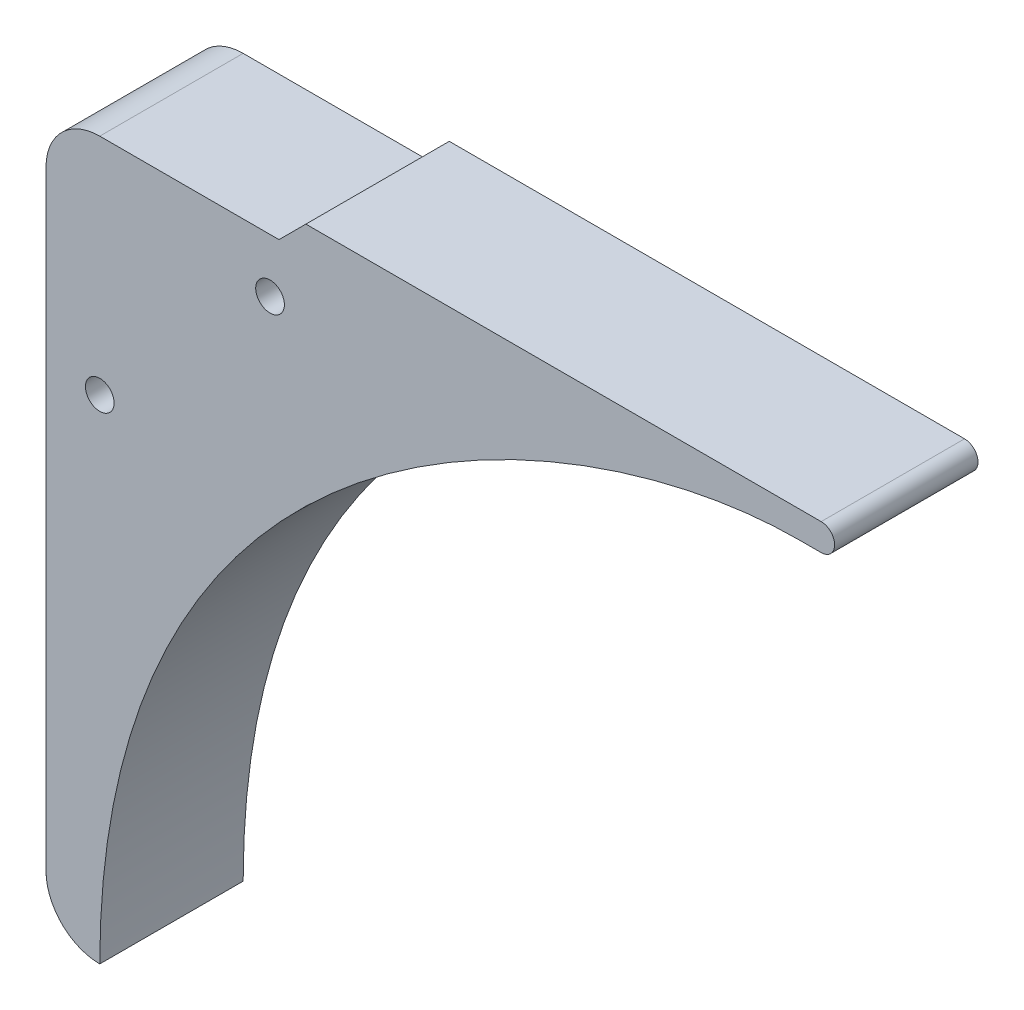
ISO-10303-21;
HEADER;
FILE_DESCRIPTION(('STEP AP214'),'2;1');
FILE_NAME('part.step','',(''),(''),'','','');
FILE_SCHEMA(('AUTOMOTIVE_DESIGN { 1 0 10303 214 1 1 1 1 }'));
ENDSEC;
DATA;
#1=APPLICATION_CONTEXT('core data for automotive mechanical design processes');
#2=APPLICATION_PROTOCOL_DEFINITION('international standard','automotive_design',2000,#1);
#3=PRODUCT_CONTEXT('',#1,'mechanical');
#4=PRODUCT('Part','Part','',(#3));
#5=PRODUCT_RELATED_PRODUCT_CATEGORY('part','',(#4));
#6=PRODUCT_DEFINITION_FORMATION('','',#4);
#7=PRODUCT_DEFINITION_CONTEXT('part definition',#1,'design');
#8=PRODUCT_DEFINITION('design','',#6,#7);
#9=PRODUCT_DEFINITION_SHAPE('','',#8);
#10=(LENGTH_UNIT() NAMED_UNIT(*) SI_UNIT(.MILLI.,.METRE.));
#11=(NAMED_UNIT(*) PLANE_ANGLE_UNIT() SI_UNIT($,.RADIAN.));
#12=(NAMED_UNIT(*) SI_UNIT($,.STERADIAN.) SOLID_ANGLE_UNIT());
#13=UNCERTAINTY_MEASURE_WITH_UNIT(LENGTH_MEASURE(1.E-05),#10,'distance_accuracy_value','');
#14=(GEOMETRIC_REPRESENTATION_CONTEXT(3) GLOBAL_UNCERTAINTY_ASSIGNED_CONTEXT((#13)) GLOBAL_UNIT_ASSIGNED_CONTEXT((#10,
#11,#12)) REPRESENTATION_CONTEXT('',''));
#15=CARTESIAN_POINT('',(0.,0.,0.));
#16=DIRECTION('',(0.,0.,1.));
#17=DIRECTION('',(1.,0.,0.));
#18=AXIS2_PLACEMENT_3D('',#15,#16,#17);
#19=CARTESIAN_POINT('',(43.25,0.75,0.));
#20=DIRECTION('',(0.,0.,1.));
#21=DIRECTION('',(1.,0.,0.));
#22=AXIS2_PLACEMENT_3D('',#19,#20,#21);
#23=CYLINDRICAL_SURFACE('',#22,0.75);
#24=DIRECTION('',(0.,0.,1.));
#25=VECTOR('',#24,1.);
#26=CARTESIAN_POINT('',(43.25,1.5,-8.));
#27=LINE('',#26,#25);
#28=CARTESIAN_POINT('',(43.25,1.5,0.));
#29=VERTEX_POINT('',#28);
#30=CARTESIAN_POINT('',(43.25,1.5,-8.));
#31=VERTEX_POINT('',#30);
#32=EDGE_CURVE('E123',#29,#31,#27,.F.);
#33=ORIENTED_EDGE('',*,*,#32,.F.);
#34=CARTESIAN_POINT('',(43.25,0.75,0.));
#35=DIRECTION('',(0.,0.,1.));
#36=DIRECTION('',(1.,0.,0.));
#37=AXIS2_PLACEMENT_3D('',#34,#35,#36);
#38=CIRCLE('',#37,0.75);
#39=CARTESIAN_POINT('',(43.25,0.,0.));
#40=VERTEX_POINT('',#39);
#41=EDGE_CURVE('E198',#40,#29,#38,.T.);
#42=ORIENTED_EDGE('',*,*,#41,.F.);
#43=DIRECTION('',(0.,0.,1.));
#44=VECTOR('',#43,1.);
#45=CARTESIAN_POINT('',(43.25,0.,-8.));
#46=LINE('',#45,#44);
#47=CARTESIAN_POINT('',(43.25,0.,-8.));
#48=VERTEX_POINT('',#47);
#49=EDGE_CURVE('E202',#48,#40,#46,.T.);
#50=ORIENTED_EDGE('',*,*,#49,.F.);
#51=CARTESIAN_POINT('',(43.25,0.75,-8.));
#52=DIRECTION('',(0.,0.,1.));
#53=DIRECTION('',(1.,0.,0.));
#54=AXIS2_PLACEMENT_3D('',#51,#52,#53);
#55=CIRCLE('',#54,0.75);
#56=EDGE_CURVE('E200',#31,#48,#55,.F.);
#57=ORIENTED_EDGE('',*,*,#56,.F.);
#58=EDGE_LOOP('',(#33,#42,#50,#57));
#59=FACE_BOUND('',#58,.T.);
#60=ADVANCED_FACE('F43',(#59),#23,.T.);
#61=CARTESIAN_POINT('',(44.,0.,-8.));
#62=DIRECTION('',(0.,-1.,0.));
#63=DIRECTION('',(1.,0.,0.));
#64=AXIS2_PLACEMENT_3D('',#61,#62,#63);
#65=PLANE('',#64);
#66=DIRECTION('',(1.,0.,0.));
#67=VECTOR('',#66,1.);
#68=CARTESIAN_POINT('',(44.,0.,-8.));
#69=LINE('',#68,#67);
#70=CARTESIAN_POINT('',(42.,0.,-8.));
#71=VERTEX_POINT('',#70);
#72=EDGE_CURVE('E127',#71,#48,#69,.T.);
#73=ORIENTED_EDGE('',*,*,#72,.T.);
#74=ORIENTED_EDGE('',*,*,#49,.T.);
#75=DIRECTION('',(1.,0.,0.));
#76=VECTOR('',#75,1.);
#77=CARTESIAN_POINT('',(44.,0.,0.));
#78=LINE('',#77,#76);
#79=CARTESIAN_POINT('',(42.,0.,0.));
#80=VERTEX_POINT('',#79);
#81=EDGE_CURVE('E157',#80,#40,#78,.T.);
#82=ORIENTED_EDGE('',*,*,#81,.F.);
#83=DIRECTION('',(0.,0.,1.));
#84=VECTOR('',#83,1.);
#85=CARTESIAN_POINT('',(42.,0.,-8.));
#86=LINE('',#85,#84);
#87=EDGE_CURVE('E228',#71,#80,#86,.T.);
#88=ORIENTED_EDGE('',*,*,#87,.F.);
#89=EDGE_LOOP('',(#73,#74,#82,#88));
#90=FACE_BOUND('',#89,.T.);
#91=ADVANCED_FACE('F168',(#90),#65,.T.);
#92=CARTESIAN_POINT('',(3.,-40.,-8.));
#93=CARTESIAN_POINT('',(2.9999999999999,-11.6867049788812,-8.));
#94=CARTESIAN_POINT('',(28.9884787016492,0.,-8.));
#95=CARTESIAN_POINT('',(42.,0.,-8.));
#96=B_SPLINE_CURVE_WITH_KNOTS('',3,(#92,#93,#94,#95),.UNSPECIFIED.,.F.,.F.,(4,4),(0.,
0.938491694388878),.UNSPECIFIED.);
#97=DIRECTION('',(0.,0.,1.));
#98=VECTOR('',#97,1.);
#99=SURFACE_OF_LINEAR_EXTRUSION('',#96,#98);
#100=CARTESIAN_POINT('',(3.,-40.,0.));
#101=CARTESIAN_POINT('',(2.9999999999999,-11.6867049788812,0.));
#102=CARTESIAN_POINT('',(28.9884787016492,0.,0.));
#103=CARTESIAN_POINT('',(42.,0.,0.));
#104=B_SPLINE_CURVE_WITH_KNOTS('',3,(#100,#101,#102,#103),.UNSPECIFIED.,.F.,.F.,(4,4),(0.,
0.938491694388878),.UNSPECIFIED.);
#105=CARTESIAN_POINT('',(3.,-40.,0.));
#106=VERTEX_POINT('',#105);
#107=EDGE_CURVE('E222',#106,#80,#104,.T.);
#108=ORIENTED_EDGE('',*,*,#107,.F.);
#109=DIRECTION('',(0.,0.,1.));
#110=VECTOR('',#109,1.);
#111=CARTESIAN_POINT('',(3.,-40.,-8.));
#112=LINE('',#111,#110);
#113=CARTESIAN_POINT('',(3.,-40.,-8.));
#114=VERTEX_POINT('',#113);
#115=EDGE_CURVE('E235',#114,#106,#112,.T.);
#116=ORIENTED_EDGE('',*,*,#115,.F.);
#117=EDGE_CURVE('E136',#114,#71,#96,.T.);
#118=ORIENTED_EDGE('',*,*,#117,.T.);
#119=ORIENTED_EDGE('',*,*,#87,.T.);
#120=EDGE_LOOP('',(#108,#116,#118,#119));
#121=FACE_BOUND('',#120,.T.);
#122=ADVANCED_FACE('F163',(#121),#99,.T.);
#123=CARTESIAN_POINT('',(0.,-40.,-8.));
#124=DIRECTION('',(-1.,0.,0.));
#125=DIRECTION('',(0.,0.,1.));
#126=AXIS2_PLACEMENT_3D('',#123,#124,#125);
#127=PLANE('',#126);
#128=DIRECTION('',(0.,-1.,0.));
#129=VECTOR('',#128,1.);
#130=CARTESIAN_POINT('',(0.,-40.,-8.));
#131=LINE('',#130,#129);
#132=CARTESIAN_POINT('',(0.,-3.,-8.));
#133=VERTEX_POINT('',#132);
#134=CARTESIAN_POINT('',(0.,-37.,-8.));
#135=VERTEX_POINT('',#134);
#136=EDGE_CURVE('E145',#133,#135,#131,.T.);
#137=ORIENTED_EDGE('',*,*,#136,.T.);
#138=DIRECTION('',(0.,0.,1.));
#139=VECTOR('',#138,1.);
#140=CARTESIAN_POINT('',(0.,-37.,-8.));
#141=LINE('',#140,#139);
#142=CARTESIAN_POINT('',(0.,-37.,0.));
#143=VERTEX_POINT('',#142);
#144=EDGE_CURVE('E257',#135,#143,#141,.T.);
#145=ORIENTED_EDGE('',*,*,#144,.T.);
#146=DIRECTION('',(0.,-1.,0.));
#147=VECTOR('',#146,1.);
#148=CARTESIAN_POINT('',(0.,-40.,0.));
#149=LINE('',#148,#147);
#150=CARTESIAN_POINT('',(0.,-3.,0.));
#151=VERTEX_POINT('',#150);
#152=EDGE_CURVE('E218',#151,#143,#149,.T.);
#153=ORIENTED_EDGE('',*,*,#152,.F.);
#154=DIRECTION('',(0.,0.,1.));
#155=VECTOR('',#154,1.);
#156=CARTESIAN_POINT('',(0.,-3.,-8.));
#157=LINE('',#156,#155);
#158=EDGE_CURVE('E246',#151,#133,#157,.F.);
#159=ORIENTED_EDGE('',*,*,#158,.T.);
#160=EDGE_LOOP('',(#137,#145,#153,#159));
#161=FACE_BOUND('',#160,.T.);
#162=ADVANCED_FACE('F167',(#161),#127,.T.);
#163=CARTESIAN_POINT('',(0.,0.,-8.));
#164=DIRECTION('',(0.,1.,0.));
#165=DIRECTION('',(0.,0.,1.));
#166=AXIS2_PLACEMENT_3D('',#163,#164,#165);
#167=PLANE('',#166);
#168=DIRECTION('',(-1.,0.,0.));
#169=VECTOR('',#168,1.);
#170=CARTESIAN_POINT('',(0.,0.,-8.));
#171=LINE('',#170,#169);
#172=CARTESIAN_POINT('',(13.,0.,-8.));
#173=VERTEX_POINT('',#172);
#174=CARTESIAN_POINT('',(3.,0.,-8.));
#175=VERTEX_POINT('',#174);
#176=EDGE_CURVE('E141',#173,#175,#171,.T.);
#177=ORIENTED_EDGE('',*,*,#176,.T.);
#178=DIRECTION('',(0.,0.,1.));
#179=VECTOR('',#178,1.);
#180=CARTESIAN_POINT('',(3.,0.,-8.));
#181=LINE('',#180,#179);
#182=CARTESIAN_POINT('',(3.,0.,0.));
#183=VERTEX_POINT('',#182);
#184=EDGE_CURVE('E234',#175,#183,#181,.T.);
#185=ORIENTED_EDGE('',*,*,#184,.T.);
#186=DIRECTION('',(-1.,0.,0.));
#187=VECTOR('',#186,1.);
#188=CARTESIAN_POINT('',(0.,0.,0.));
#189=LINE('',#188,#187);
#190=CARTESIAN_POINT('',(13.,0.,0.));
#191=VERTEX_POINT('',#190);
#192=EDGE_CURVE('E210',#191,#183,#189,.T.);
#193=ORIENTED_EDGE('',*,*,#192,.F.);
#194=DIRECTION('',(0.,0.,1.));
#195=VECTOR('',#194,1.);
#196=CARTESIAN_POINT('',(13.,0.,-8.));
#197=LINE('',#196,#195);
#198=EDGE_CURVE('E135',#173,#191,#197,.T.);
#199=ORIENTED_EDGE('',*,*,#198,.F.);
#200=EDGE_LOOP('',(#177,#185,#193,#199));
#201=FACE_BOUND('',#200,.T.);
#202=ADVANCED_FACE('F174',(#201),#167,.T.);
#203=CARTESIAN_POINT('',(13.,0.,-8.));
#204=DIRECTION('',(-0.707106781186548,0.707106781186547,0.));
#205=DIRECTION('',(-0.707106781186547,-0.707106781186548,0.));
#206=AXIS2_PLACEMENT_3D('',#203,#204,#205);
#207=PLANE('',#206);
#208=DIRECTION('',(-0.707106781186547,-0.707106781186548,0.));
#209=VECTOR('',#208,1.);
#210=CARTESIAN_POINT('',(13.,0.,0.));
#211=LINE('',#210,#209);
#212=CARTESIAN_POINT('',(14.5,1.5,0.));
#213=VERTEX_POINT('',#212);
#214=EDGE_CURVE('E133',#213,#191,#211,.T.);
#215=ORIENTED_EDGE('',*,*,#214,.F.);
#216=DIRECTION('',(0.,0.,1.));
#217=VECTOR('',#216,1.);
#218=CARTESIAN_POINT('',(14.5,1.5,-8.));
#219=LINE('',#218,#217);
#220=CARTESIAN_POINT('',(14.5,1.5,-8.));
#221=VERTEX_POINT('',#220);
#222=EDGE_CURVE('E120',#221,#213,#219,.T.);
#223=ORIENTED_EDGE('',*,*,#222,.F.);
#224=DIRECTION('',(-0.707106781186547,-0.707106781186548,0.));
#225=VECTOR('',#224,1.);
#226=CARTESIAN_POINT('',(13.,0.,-8.));
#227=LINE('',#226,#225);
#228=EDGE_CURVE('E126',#221,#173,#227,.T.);
#229=ORIENTED_EDGE('',*,*,#228,.T.);
#230=ORIENTED_EDGE('',*,*,#198,.T.);
#231=EDGE_LOOP('',(#215,#223,#229,#230));
#232=FACE_BOUND('',#231,.T.);
#233=ADVANCED_FACE('F131',(#232),#207,.T.);
#234=CARTESIAN_POINT('',(14.5,1.5,-8.));
#235=DIRECTION('',(0.,1.,0.));
#236=DIRECTION('',(0.,0.,1.));
#237=AXIS2_PLACEMENT_3D('',#234,#235,#236);
#238=PLANE('',#237);
#239=DIRECTION('',(-1.,0.,0.));
#240=VECTOR('',#239,1.);
#241=CARTESIAN_POINT('',(14.5,1.5,0.));
#242=LINE('',#241,#240);
#243=EDGE_CURVE('E205',#29,#213,#242,.T.);
#244=ORIENTED_EDGE('',*,*,#243,.F.);
#245=ORIENTED_EDGE('',*,*,#32,.T.);
#246=DIRECTION('',(-1.,0.,0.));
#247=VECTOR('',#246,1.);
#248=CARTESIAN_POINT('',(14.5,1.5,-8.));
#249=LINE('',#248,#247);
#250=EDGE_CURVE('E116',#31,#221,#249,.T.);
#251=ORIENTED_EDGE('',*,*,#250,.T.);
#252=ORIENTED_EDGE('',*,*,#222,.T.);
#253=EDGE_LOOP('',(#244,#245,#251,#252));
#254=FACE_BOUND('',#253,.T.);
#255=ADVANCED_FACE('F119',(#254),#238,.T.);
#256=CARTESIAN_POINT('',(17.6206795131184,-9.38251436708044,-8.));
#257=DIRECTION('',(0.,0.,1.));
#258=DIRECTION('',(1.,0.,0.));
#259=AXIS2_PLACEMENT_3D('',#256,#257,#258);
#260=PLANE('',#259);
#261=CARTESIAN_POINT('',(3.,-12.5,-8.));
#262=DIRECTION('',(0.,0.,1.));
#263=DIRECTION('',(1.,0.,0.));
#264=AXIS2_PLACEMENT_3D('',#261,#262,#263);
#265=CIRCLE('',#264,0.799999999999998);
#266=CARTESIAN_POINT('',(3.8,-12.5,-8.));
#267=VERTEX_POINT('',#266);
#268=EDGE_CURVE('E289',#267,#267,#265,.T.);
#269=ORIENTED_EDGE('',*,*,#268,.T.);
#270=EDGE_LOOP('',(#269));
#271=FACE_BOUND('',#270,.T.);
#272=CARTESIAN_POINT('',(12.5,-3.,-8.));
#273=DIRECTION('',(0.,0.,1.));
#274=DIRECTION('',(1.,0.,0.));
#275=AXIS2_PLACEMENT_3D('',#272,#273,#274);
#276=CIRCLE('',#275,0.799999999999999);
#277=CARTESIAN_POINT('',(13.3,-3.,-8.));
#278=VERTEX_POINT('',#277);
#279=EDGE_CURVE('E213',#278,#278,#276,.T.);
#280=ORIENTED_EDGE('',*,*,#279,.T.);
#281=EDGE_LOOP('',(#280));
#282=FACE_BOUND('',#281,.T.);
#283=ORIENTED_EDGE('',*,*,#117,.F.);
#284=CARTESIAN_POINT('',(3.,-37.,-8.));
#285=DIRECTION('',(0.,0.,1.));
#286=DIRECTION('',(1.,0.,0.));
#287=AXIS2_PLACEMENT_3D('',#284,#285,#286);
#288=CIRCLE('',#287,3.);
#289=EDGE_CURVE('E11',#114,#135,#288,.F.);
#290=ORIENTED_EDGE('',*,*,#289,.T.);
#291=ORIENTED_EDGE('',*,*,#136,.F.);
#292=CARTESIAN_POINT('',(3.,-3.,-8.));
#293=DIRECTION('',(0.,0.,1.));
#294=DIRECTION('',(1.,0.,0.));
#295=AXIS2_PLACEMENT_3D('',#292,#293,#294);
#296=CIRCLE('',#295,3.);
#297=EDGE_CURVE('E203',#133,#175,#296,.F.);
#298=ORIENTED_EDGE('',*,*,#297,.T.);
#299=ORIENTED_EDGE('',*,*,#176,.F.);
#300=ORIENTED_EDGE('',*,*,#228,.F.);
#301=ORIENTED_EDGE('',*,*,#250,.F.);
#302=ORIENTED_EDGE('',*,*,#56,.T.);
#303=ORIENTED_EDGE('',*,*,#72,.F.);
#304=EDGE_LOOP('',(#283,#290,#291,#298,#299,#300,#301,#302,#303));
#305=FACE_BOUND('',#304,.T.);
#306=ADVANCED_FACE('F139',(#271,#282,#305),#260,.F.);
#307=CARTESIAN_POINT('',(17.6206795131184,-9.38251436708044,0.));
#308=DIRECTION('',(0.,0.,1.));
#309=DIRECTION('',(1.,0.,0.));
#310=AXIS2_PLACEMENT_3D('',#307,#308,#309);
#311=PLANE('',#310);
#312=CARTESIAN_POINT('',(3.,-12.5,0.));
#313=DIRECTION('',(0.,0.,1.));
#314=DIRECTION('',(1.,0.,0.));
#315=AXIS2_PLACEMENT_3D('',#312,#313,#314);
#316=CIRCLE('',#315,0.799999999999999);
#317=CARTESIAN_POINT('',(3.8,-12.5,0.));
#318=VERTEX_POINT('',#317);
#319=EDGE_CURVE('E304',#318,#318,#316,.T.);
#320=ORIENTED_EDGE('',*,*,#319,.F.);
#321=EDGE_LOOP('',(#320));
#322=FACE_BOUND('',#321,.T.);
#323=CARTESIAN_POINT('',(12.5,-3.,0.));
#324=DIRECTION('',(0.,0.,1.));
#325=DIRECTION('',(1.,0.,0.));
#326=AXIS2_PLACEMENT_3D('',#323,#324,#325);
#327=CIRCLE('',#326,0.799999999999999);
#328=CARTESIAN_POINT('',(13.3,-3.,0.));
#329=VERTEX_POINT('',#328);
#330=EDGE_CURVE('E293',#329,#329,#327,.T.);
#331=ORIENTED_EDGE('',*,*,#330,.F.);
#332=EDGE_LOOP('',(#331));
#333=FACE_BOUND('',#332,.T.);
#334=ORIENTED_EDGE('',*,*,#152,.T.);
#335=CARTESIAN_POINT('',(3.,-37.,0.));
#336=DIRECTION('',(0.,0.,1.));
#337=DIRECTION('',(1.,0.,0.));
#338=AXIS2_PLACEMENT_3D('',#335,#336,#337);
#339=CIRCLE('',#338,3.);
#340=EDGE_CURVE('E52',#143,#106,#339,.T.);
#341=ORIENTED_EDGE('',*,*,#340,.T.);
#342=ORIENTED_EDGE('',*,*,#107,.T.);
#343=ORIENTED_EDGE('',*,*,#81,.T.);
#344=ORIENTED_EDGE('',*,*,#41,.T.);
#345=ORIENTED_EDGE('',*,*,#243,.T.);
#346=ORIENTED_EDGE('',*,*,#214,.T.);
#347=ORIENTED_EDGE('',*,*,#192,.T.);
#348=CARTESIAN_POINT('',(3.,-3.,0.));
#349=DIRECTION('',(0.,0.,1.));
#350=DIRECTION('',(1.,0.,0.));
#351=AXIS2_PLACEMENT_3D('',#348,#349,#350);
#352=CIRCLE('',#351,3.);
#353=EDGE_CURVE('E243',#183,#151,#352,.T.);
#354=ORIENTED_EDGE('',*,*,#353,.T.);
#355=EDGE_LOOP('',(#334,#341,#342,#343,#344,#345,#346,#347,#354));
#356=FACE_BOUND('',#355,.T.);
#357=ADVANCED_FACE('F170',(#322,#333,#356),#311,.T.);
#358=CARTESIAN_POINT('',(3.,-3.,-8.));
#359=DIRECTION('',(0.,0.,1.));
#360=DIRECTION('',(1.,0.,0.));
#361=AXIS2_PLACEMENT_3D('',#358,#359,#360);
#362=CYLINDRICAL_SURFACE('',#361,3.);
#363=ORIENTED_EDGE('',*,*,#297,.F.);
#364=ORIENTED_EDGE('',*,*,#158,.F.);
#365=ORIENTED_EDGE('',*,*,#353,.F.);
#366=ORIENTED_EDGE('',*,*,#184,.F.);
#367=EDGE_LOOP('',(#363,#364,#365,#366));
#368=FACE_BOUND('',#367,.T.);
#369=ADVANCED_FACE('F186',(#368),#362,.T.);
#370=CARTESIAN_POINT('',(12.5,-3.,0.));
#371=DIRECTION('',(0.,0.,1.));
#372=DIRECTION('',(1.,0.,0.));
#373=AXIS2_PLACEMENT_3D('',#370,#371,#372);
#374=CYLINDRICAL_SURFACE('',#373,0.799999999999999);
#375=ORIENTED_EDGE('',*,*,#279,.F.);
#376=EDGE_LOOP('',(#375));
#377=FACE_BOUND('',#376,.T.);
#378=ORIENTED_EDGE('',*,*,#330,.T.);
#379=EDGE_LOOP('',(#378));
#380=FACE_BOUND('',#379,.T.);
#381=ADVANCED_FACE('F188',(#377,#380),#374,.F.);
#382=CARTESIAN_POINT('',(3.,-12.5,0.));
#383=DIRECTION('',(0.,0.,1.));
#384=DIRECTION('',(1.,0.,0.));
#385=AXIS2_PLACEMENT_3D('',#382,#383,#384);
#386=CYLINDRICAL_SURFACE('',#385,0.799999999999998);
#387=ORIENTED_EDGE('',*,*,#268,.F.);
#388=EDGE_LOOP('',(#387));
#389=FACE_BOUND('',#388,.T.);
#390=ORIENTED_EDGE('',*,*,#319,.T.);
#391=EDGE_LOOP('',(#390));
#392=FACE_BOUND('',#391,.T.);
#393=ADVANCED_FACE('F268',(#389,#392),#386,.F.);
#394=CARTESIAN_POINT('',(3.,-37.,-8.));
#395=DIRECTION('',(0.,0.,1.));
#396=DIRECTION('',(1.,0.,0.));
#397=AXIS2_PLACEMENT_3D('',#394,#395,#396);
#398=CYLINDRICAL_SURFACE('',#397,3.);
#399=ORIENTED_EDGE('',*,*,#289,.F.);
#400=ORIENTED_EDGE('',*,*,#115,.T.);
#401=ORIENTED_EDGE('',*,*,#340,.F.);
#402=ORIENTED_EDGE('',*,*,#144,.F.);
#403=EDGE_LOOP('',(#399,#400,#401,#402));
#404=FACE_BOUND('',#403,.T.);
#405=ADVANCED_FACE('F45',(#404),#398,.T.);
#406=CLOSED_SHELL('',(#60,#91,#122,#162,#202,#233,#255,#306,#357,#369,#381,#393,#405));
#407=MANIFOLD_SOLID_BREP('B2',#406);
#408=ADVANCED_BREP_SHAPE_REPRESENTATION('',(#18,#407),#14);
#409=SHAPE_DEFINITION_REPRESENTATION(#9,#408);
ENDSEC;
END-ISO-10303-21;
